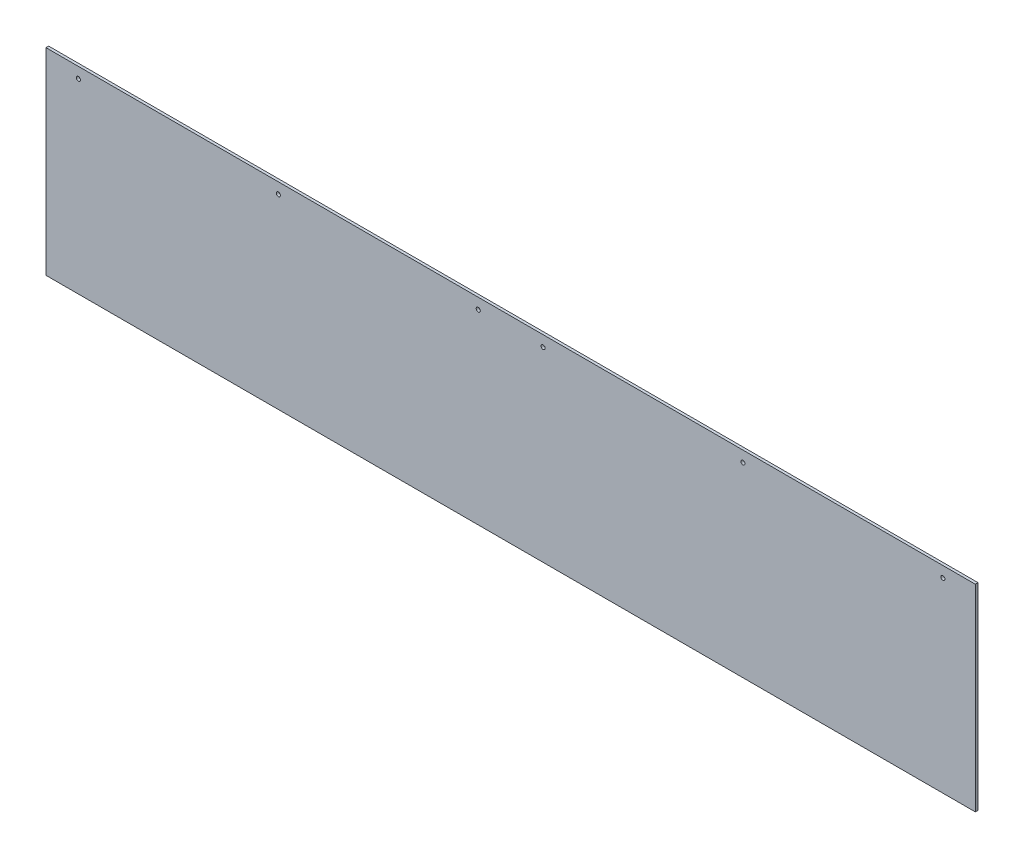
ISO-10303-21;
HEADER;
FILE_DESCRIPTION(('STEP AP214'),'2;1');
FILE_NAME('part.step','',(''),(''),'','','');
FILE_SCHEMA(('AUTOMOTIVE_DESIGN { 1 0 10303 214 1 1 1 1 }'));
ENDSEC;
DATA;
#1=APPLICATION_CONTEXT('core data for automotive mechanical design processes');
#2=APPLICATION_PROTOCOL_DEFINITION('international standard','automotive_design',2000,#1);
#3=PRODUCT_CONTEXT('',#1,'mechanical');
#4=PRODUCT('Part','Part','',(#3));
#5=PRODUCT_RELATED_PRODUCT_CATEGORY('part','',(#4));
#6=PRODUCT_DEFINITION_FORMATION('','',#4);
#7=PRODUCT_DEFINITION_CONTEXT('part definition',#1,'design');
#8=PRODUCT_DEFINITION('design','',#6,#7);
#9=PRODUCT_DEFINITION_SHAPE('','',#8);
#10=(LENGTH_UNIT() NAMED_UNIT(*) SI_UNIT(.MILLI.,.METRE.));
#11=(NAMED_UNIT(*) PLANE_ANGLE_UNIT() SI_UNIT($,.RADIAN.));
#12=(NAMED_UNIT(*) SI_UNIT($,.STERADIAN.) SOLID_ANGLE_UNIT());
#13=UNCERTAINTY_MEASURE_WITH_UNIT(LENGTH_MEASURE(1.E-05),#10,'distance_accuracy_value','');
#14=(GEOMETRIC_REPRESENTATION_CONTEXT(3) GLOBAL_UNCERTAINTY_ASSIGNED_CONTEXT((#13)) GLOBAL_UNIT_ASSIGNED_CONTEXT((#10,
#11,#12)) REPRESENTATION_CONTEXT('',''));
#15=CARTESIAN_POINT('',(0.,0.,0.));
#16=DIRECTION('',(0.,0.,1.));
#17=DIRECTION('',(1.,0.,0.));
#18=AXIS2_PLACEMENT_3D('',#15,#16,#17);
#19=CARTESIAN_POINT('',(1638.3,438.15,-2233.05223517051));
#20=DIRECTION('',(0.,0.,1.));
#21=DIRECTION('',(1.,0.,0.));
#22=AXIS2_PLACEMENT_3D('',#19,#20,#21);
#23=CYLINDRICAL_SURFACE('',#22,4.826);
#24=CARTESIAN_POINT('',(1638.3,438.15,-6.3499999999999));
#25=DIRECTION('',(0.,0.,1.));
#26=DIRECTION('',(1.,0.,0.));
#27=AXIS2_PLACEMENT_3D('',#24,#25,#26);
#28=CIRCLE('',#27,4.826);
#29=CARTESIAN_POINT('',(1643.126,438.15,-6.3499999999999));
#30=VERTEX_POINT('',#29);
#31=EDGE_CURVE('E81',#30,#30,#28,.T.);
#32=ORIENTED_EDGE('',*,*,#31,.F.);
#33=EDGE_LOOP('',(#32));
#34=FACE_BOUND('',#33,.T.);
#35=CARTESIAN_POINT('',(1638.3,438.15,0.));
#36=DIRECTION('',(0.,0.,-1.));
#37=DIRECTION('',(0.,-1.,0.));
#38=AXIS2_PLACEMENT_3D('',#35,#36,#37);
#39=CIRCLE('',#38,4.826);
#40=CARTESIAN_POINT('',(1638.3,433.324,0.));
#41=VERTEX_POINT('',#40);
#42=EDGE_CURVE('E94',#41,#41,#39,.T.);
#43=ORIENTED_EDGE('',*,*,#42,.F.);
#44=EDGE_LOOP('',(#43));
#45=FACE_BOUND('',#44,.T.);
#46=ADVANCED_FACE('F16',(#34,#45),#23,.F.);
#47=CARTESIAN_POINT('',(1016.,438.15,-2233.05223517051));
#48=DIRECTION('',(0.,0.,1.));
#49=DIRECTION('',(1.,0.,0.));
#50=AXIS2_PLACEMENT_3D('',#47,#48,#49);
#51=CYLINDRICAL_SURFACE('',#50,4.826);
#52=CARTESIAN_POINT('',(1016.,438.15,-6.3499999999999));
#53=DIRECTION('',(0.,0.,1.));
#54=DIRECTION('',(1.,0.,0.));
#55=AXIS2_PLACEMENT_3D('',#52,#53,#54);
#56=CIRCLE('',#55,4.826);
#57=CARTESIAN_POINT('',(1020.826,438.15,-6.3499999999999));
#58=VERTEX_POINT('',#57);
#59=EDGE_CURVE('E120',#58,#58,#56,.T.);
#60=ORIENTED_EDGE('',*,*,#59,.F.);
#61=EDGE_LOOP('',(#60));
#62=FACE_BOUND('',#61,.T.);
#63=CARTESIAN_POINT('',(1016.,438.15,0.));
#64=DIRECTION('',(0.,0.,-1.));
#65=DIRECTION('',(0.,-1.,0.));
#66=AXIS2_PLACEMENT_3D('',#63,#64,#65);
#67=CIRCLE('',#66,4.826);
#68=CARTESIAN_POINT('',(1016.,433.324,0.));
#69=VERTEX_POINT('',#68);
#70=EDGE_CURVE('E117',#69,#69,#67,.T.);
#71=ORIENTED_EDGE('',*,*,#70,.F.);
#72=EDGE_LOOP('',(#71));
#73=FACE_BOUND('',#72,.T.);
#74=ADVANCED_FACE('F133',(#62,#73),#51,.F.);
#75=CARTESIAN_POINT('',(76.2,438.15,-2233.05223517051));
#76=DIRECTION('',(0.,0.,1.));
#77=DIRECTION('',(1.,0.,0.));
#78=AXIS2_PLACEMENT_3D('',#75,#76,#77);
#79=CYLINDRICAL_SURFACE('',#78,4.826);
#80=CARTESIAN_POINT('',(76.2,438.15,-6.3499999999999));
#81=DIRECTION('',(0.,0.,1.));
#82=DIRECTION('',(1.,0.,0.));
#83=AXIS2_PLACEMENT_3D('',#80,#81,#82);
#84=CIRCLE('',#83,4.826);
#85=CARTESIAN_POINT('',(81.026,438.15,-6.3499999999999));
#86=VERTEX_POINT('',#85);
#87=EDGE_CURVE('E114',#86,#86,#84,.T.);
#88=ORIENTED_EDGE('',*,*,#87,.F.);
#89=EDGE_LOOP('',(#88));
#90=FACE_BOUND('',#89,.T.);
#91=CARTESIAN_POINT('',(76.2,438.15,0.));
#92=DIRECTION('',(0.,0.,-1.));
#93=DIRECTION('',(0.,-1.,0.));
#94=AXIS2_PLACEMENT_3D('',#91,#92,#93);
#95=CIRCLE('',#94,4.826);
#96=CARTESIAN_POINT('',(76.2,433.324,0.));
#97=VERTEX_POINT('',#96);
#98=EDGE_CURVE('E111',#97,#97,#95,.T.);
#99=ORIENTED_EDGE('',*,*,#98,.F.);
#100=EDGE_LOOP('',(#99));
#101=FACE_BOUND('',#100,.T.);
#102=ADVANCED_FACE('F173',(#90,#101),#79,.F.);
#103=CARTESIAN_POINT('',(546.1,438.15,-2233.05223517051));
#104=DIRECTION('',(0.,0.,1.));
#105=DIRECTION('',(1.,0.,0.));
#106=AXIS2_PLACEMENT_3D('',#103,#104,#105);
#107=CYLINDRICAL_SURFACE('',#106,4.826);
#108=CARTESIAN_POINT('',(546.1,438.15,-6.3499999999999));
#109=DIRECTION('',(0.,0.,1.));
#110=DIRECTION('',(1.,0.,0.));
#111=AXIS2_PLACEMENT_3D('',#108,#109,#110);
#112=CIRCLE('',#111,4.826);
#113=CARTESIAN_POINT('',(550.926,438.15,-6.3499999999999));
#114=VERTEX_POINT('',#113);
#115=EDGE_CURVE('E108',#114,#114,#112,.T.);
#116=ORIENTED_EDGE('',*,*,#115,.F.);
#117=EDGE_LOOP('',(#116));
#118=FACE_BOUND('',#117,.T.);
#119=CARTESIAN_POINT('',(546.1,438.15,0.));
#120=DIRECTION('',(0.,0.,-1.));
#121=DIRECTION('',(0.,-1.,0.));
#122=AXIS2_PLACEMENT_3D('',#119,#120,#121);
#123=CIRCLE('',#122,4.826);
#124=CARTESIAN_POINT('',(546.1,433.324,0.));
#125=VERTEX_POINT('',#124);
#126=EDGE_CURVE('E105',#125,#125,#123,.T.);
#127=ORIENTED_EDGE('',*,*,#126,.F.);
#128=EDGE_LOOP('',(#127));
#129=FACE_BOUND('',#128,.T.);
#130=ADVANCED_FACE('F159',(#118,#129),#107,.F.);
#131=CARTESIAN_POINT('',(1168.4,438.15,-2233.05223517051));
#132=DIRECTION('',(0.,0.,1.));
#133=DIRECTION('',(1.,0.,0.));
#134=AXIS2_PLACEMENT_3D('',#131,#132,#133);
#135=CYLINDRICAL_SURFACE('',#134,4.826);
#136=CARTESIAN_POINT('',(1168.4,438.15,-6.3499999999999));
#137=DIRECTION('',(0.,0.,1.));
#138=DIRECTION('',(1.,0.,0.));
#139=AXIS2_PLACEMENT_3D('',#136,#137,#138);
#140=CIRCLE('',#139,4.826);
#141=CARTESIAN_POINT('',(1173.226,438.15,-6.3499999999999));
#142=VERTEX_POINT('',#141);
#143=EDGE_CURVE('E88',#142,#142,#140,.T.);
#144=ORIENTED_EDGE('',*,*,#143,.F.);
#145=EDGE_LOOP('',(#144));
#146=FACE_BOUND('',#145,.T.);
#147=CARTESIAN_POINT('',(1168.4,438.15,0.));
#148=DIRECTION('',(0.,0.,-1.));
#149=DIRECTION('',(0.,-1.,0.));
#150=AXIS2_PLACEMENT_3D('',#147,#148,#149);
#151=CIRCLE('',#150,4.826);
#152=CARTESIAN_POINT('',(1168.4,433.324,0.));
#153=VERTEX_POINT('',#152);
#154=EDGE_CURVE('E101',#153,#153,#151,.T.);
#155=ORIENTED_EDGE('',*,*,#154,.F.);
#156=EDGE_LOOP('',(#155));
#157=FACE_BOUND('',#156,.T.);
#158=ADVANCED_FACE('F150',(#146,#157),#135,.F.);
#159=CARTESIAN_POINT('',(2108.2,438.15,-2233.05223517051));
#160=DIRECTION('',(0.,0.,1.));
#161=DIRECTION('',(1.,0.,0.));
#162=AXIS2_PLACEMENT_3D('',#159,#160,#161);
#163=CYLINDRICAL_SURFACE('',#162,4.826);
#164=CARTESIAN_POINT('',(2108.2,438.15,-6.3499999999999));
#165=DIRECTION('',(0.,0.,1.));
#166=DIRECTION('',(1.,0.,0.));
#167=AXIS2_PLACEMENT_3D('',#164,#165,#166);
#168=CIRCLE('',#167,4.826);
#169=CARTESIAN_POINT('',(2113.026,438.15,-6.3499999999999));
#170=VERTEX_POINT('',#169);
#171=EDGE_CURVE('E86',#170,#170,#168,.T.);
#172=ORIENTED_EDGE('',*,*,#171,.F.);
#173=EDGE_LOOP('',(#172));
#174=FACE_BOUND('',#173,.T.);
#175=CARTESIAN_POINT('',(2108.2,438.15,0.));
#176=DIRECTION('',(0.,0.,-1.));
#177=DIRECTION('',(0.,-1.,0.));
#178=AXIS2_PLACEMENT_3D('',#175,#176,#177);
#179=CIRCLE('',#178,4.826);
#180=CARTESIAN_POINT('',(2108.2,433.324,0.));
#181=VERTEX_POINT('',#180);
#182=EDGE_CURVE('E99',#181,#181,#179,.T.);
#183=ORIENTED_EDGE('',*,*,#182,.F.);
#184=EDGE_LOOP('',(#183));
#185=FACE_BOUND('',#184,.T.);
#186=ADVANCED_FACE('F18',(#174,#185),#163,.F.);
#187=CARTESIAN_POINT('',(2184.4,463.55,0.));
#188=DIRECTION('',(1.,0.,0.));
#189=DIRECTION('',(0.,0.,-1.));
#190=AXIS2_PLACEMENT_3D('',#187,#188,#189);
#191=PLANE('',#190);
#192=DIRECTION('',(0.,1.,0.));
#193=VECTOR('',#192,1.);
#194=CARTESIAN_POINT('',(2184.4,0.,0.));
#195=LINE('',#194,#193);
#196=CARTESIAN_POINT('',(2184.4,0.,0.));
#197=VERTEX_POINT('',#196);
#198=CARTESIAN_POINT('',(2184.4,463.55,0.));
#199=VERTEX_POINT('',#198);
#200=EDGE_CURVE('E34',#197,#199,#195,.T.);
#201=ORIENTED_EDGE('',*,*,#200,.F.);
#202=DIRECTION('',(0.,0.,-1.));
#203=VECTOR('',#202,1.);
#204=CARTESIAN_POINT('',(2184.4,0.,0.));
#205=LINE('',#204,#203);
#206=CARTESIAN_POINT('',(2184.4,0.,-6.35));
#207=VERTEX_POINT('',#206);
#208=EDGE_CURVE('E10',#197,#207,#205,.T.);
#209=ORIENTED_EDGE('',*,*,#208,.T.);
#210=DIRECTION('',(0.,-1.,0.));
#211=VECTOR('',#210,1.);
#212=CARTESIAN_POINT('',(2184.4,463.55,-6.35));
#213=LINE('',#212,#211);
#214=CARTESIAN_POINT('',(2184.4,463.55,-6.35));
#215=VERTEX_POINT('',#214);
#216=EDGE_CURVE('E79',#215,#207,#213,.T.);
#217=ORIENTED_EDGE('',*,*,#216,.F.);
#218=DIRECTION('',(0.,0.,-1.));
#219=VECTOR('',#218,1.);
#220=CARTESIAN_POINT('',(2184.4,463.55,0.));
#221=LINE('',#220,#219);
#222=EDGE_CURVE('E26',#199,#215,#221,.T.);
#223=ORIENTED_EDGE('',*,*,#222,.F.);
#224=EDGE_LOOP('',(#201,#209,#217,#223));
#225=FACE_BOUND('',#224,.T.);
#226=ADVANCED_FACE('F83',(#225),#191,.T.);
#227=CARTESIAN_POINT('',(0.,463.55,0.));
#228=DIRECTION('',(0.,1.,0.));
#229=DIRECTION('',(0.,0.,1.));
#230=AXIS2_PLACEMENT_3D('',#227,#228,#229);
#231=PLANE('',#230);
#232=DIRECTION('',(-1.,0.,0.));
#233=VECTOR('',#232,1.);
#234=CARTESIAN_POINT('',(2184.4,463.55,0.));
#235=LINE('',#234,#233);
#236=CARTESIAN_POINT('',(0.,463.55,0.));
#237=VERTEX_POINT('',#236);
#238=EDGE_CURVE('E90',#199,#237,#235,.T.);
#239=ORIENTED_EDGE('',*,*,#238,.F.);
#240=ORIENTED_EDGE('',*,*,#222,.T.);
#241=DIRECTION('',(1.,0.,0.));
#242=VECTOR('',#241,1.);
#243=CARTESIAN_POINT('',(0.,463.55,-6.35));
#244=LINE('',#243,#242);
#245=CARTESIAN_POINT('',(0.,463.55,-6.35));
#246=VERTEX_POINT('',#245);
#247=EDGE_CURVE('E70',#246,#215,#244,.T.);
#248=ORIENTED_EDGE('',*,*,#247,.F.);
#249=DIRECTION('',(0.,0.,-1.));
#250=VECTOR('',#249,1.);
#251=CARTESIAN_POINT('',(0.,463.55,0.));
#252=LINE('',#251,#250);
#253=EDGE_CURVE('E66',#237,#246,#252,.T.);
#254=ORIENTED_EDGE('',*,*,#253,.F.);
#255=EDGE_LOOP('',(#239,#240,#248,#254));
#256=FACE_BOUND('',#255,.T.);
#257=ADVANCED_FACE('F157',(#256),#231,.T.);
#258=CARTESIAN_POINT('',(0.,0.,0.));
#259=DIRECTION('',(-1.,0.,0.));
#260=DIRECTION('',(0.,0.,1.));
#261=AXIS2_PLACEMENT_3D('',#258,#259,#260);
#262=PLANE('',#261);
#263=DIRECTION('',(0.,-1.,0.));
#264=VECTOR('',#263,1.);
#265=CARTESIAN_POINT('',(0.,463.55,0.));
#266=LINE('',#265,#264);
#267=CARTESIAN_POINT('',(0.,0.,0.));
#268=VERTEX_POINT('',#267);
#269=EDGE_CURVE('E54',#237,#268,#266,.T.);
#270=ORIENTED_EDGE('',*,*,#269,.F.);
#271=ORIENTED_EDGE('',*,*,#253,.T.);
#272=DIRECTION('',(0.,1.,0.));
#273=VECTOR('',#272,1.);
#274=CARTESIAN_POINT('',(0.,0.,-6.35));
#275=LINE('',#274,#273);
#276=CARTESIAN_POINT('',(0.,0.,-6.35));
#277=VERTEX_POINT('',#276);
#278=EDGE_CURVE('E60',#277,#246,#275,.T.);
#279=ORIENTED_EDGE('',*,*,#278,.F.);
#280=DIRECTION('',(0.,0.,-1.));
#281=VECTOR('',#280,1.);
#282=CARTESIAN_POINT('',(0.,0.,0.));
#283=LINE('',#282,#281);
#284=EDGE_CURVE('E63',#268,#277,#283,.T.);
#285=ORIENTED_EDGE('',*,*,#284,.F.);
#286=EDGE_LOOP('',(#270,#271,#279,#285));
#287=FACE_BOUND('',#286,.T.);
#288=ADVANCED_FACE('F62',(#287),#262,.T.);
#289=CARTESIAN_POINT('',(2184.4,0.,0.));
#290=DIRECTION('',(0.,-1.,0.));
#291=DIRECTION('',(0.,0.,-1.));
#292=AXIS2_PLACEMENT_3D('',#289,#290,#291);
#293=PLANE('',#292);
#294=DIRECTION('',(1.,0.,0.));
#295=VECTOR('',#294,1.);
#296=CARTESIAN_POINT('',(0.,0.,0.));
#297=LINE('',#296,#295);
#298=EDGE_CURVE('E75',#268,#197,#297,.T.);
#299=ORIENTED_EDGE('',*,*,#298,.F.);
#300=ORIENTED_EDGE('',*,*,#284,.T.);
#301=DIRECTION('',(-1.,0.,0.));
#302=VECTOR('',#301,1.);
#303=CARTESIAN_POINT('',(2184.4,0.,-6.35));
#304=LINE('',#303,#302);
#305=EDGE_CURVE('E20',#207,#277,#304,.T.);
#306=ORIENTED_EDGE('',*,*,#305,.F.);
#307=ORIENTED_EDGE('',*,*,#208,.F.);
#308=EDGE_LOOP('',(#299,#300,#306,#307));
#309=FACE_BOUND('',#308,.T.);
#310=ADVANCED_FACE('F74',(#309),#293,.T.);
#311=CARTESIAN_POINT('',(1092.2,231.775,-6.35));
#312=DIRECTION('',(0.,0.,1.));
#313=DIRECTION('',(1.,0.,0.));
#314=AXIS2_PLACEMENT_3D('',#311,#312,#313);
#315=PLANE('',#314);
#316=ORIENTED_EDGE('',*,*,#305,.T.);
#317=ORIENTED_EDGE('',*,*,#278,.T.);
#318=ORIENTED_EDGE('',*,*,#247,.T.);
#319=ORIENTED_EDGE('',*,*,#216,.T.);
#320=EDGE_LOOP('',(#316,#317,#318,#319));
#321=FACE_BOUND('',#320,.T.);
#322=ORIENTED_EDGE('',*,*,#31,.T.);
#323=EDGE_LOOP('',(#322));
#324=FACE_BOUND('',#323,.T.);
#325=ORIENTED_EDGE('',*,*,#59,.T.);
#326=EDGE_LOOP('',(#325));
#327=FACE_BOUND('',#326,.T.);
#328=ORIENTED_EDGE('',*,*,#87,.T.);
#329=EDGE_LOOP('',(#328));
#330=FACE_BOUND('',#329,.T.);
#331=ORIENTED_EDGE('',*,*,#115,.T.);
#332=EDGE_LOOP('',(#331));
#333=FACE_BOUND('',#332,.T.);
#334=ORIENTED_EDGE('',*,*,#143,.T.);
#335=EDGE_LOOP('',(#334));
#336=FACE_BOUND('',#335,.T.);
#337=ORIENTED_EDGE('',*,*,#171,.T.);
#338=EDGE_LOOP('',(#337));
#339=FACE_BOUND('',#338,.T.);
#340=ADVANCED_FACE('F77',(#321,#324,#327,#330,#333,#336,#339),#315,.F.);
#341=CARTESIAN_POINT('',(1092.2,231.775,0.));
#342=DIRECTION('',(0.,0.,1.));
#343=DIRECTION('',(1.,0.,0.));
#344=AXIS2_PLACEMENT_3D('',#341,#342,#343);
#345=PLANE('',#344);
#346=ORIENTED_EDGE('',*,*,#298,.T.);
#347=ORIENTED_EDGE('',*,*,#200,.T.);
#348=ORIENTED_EDGE('',*,*,#238,.T.);
#349=ORIENTED_EDGE('',*,*,#269,.T.);
#350=EDGE_LOOP('',(#346,#347,#348,#349));
#351=FACE_BOUND('',#350,.T.);
#352=ORIENTED_EDGE('',*,*,#42,.T.);
#353=EDGE_LOOP('',(#352));
#354=FACE_BOUND('',#353,.T.);
#355=ORIENTED_EDGE('',*,*,#70,.T.);
#356=EDGE_LOOP('',(#355));
#357=FACE_BOUND('',#356,.T.);
#358=ORIENTED_EDGE('',*,*,#98,.T.);
#359=EDGE_LOOP('',(#358));
#360=FACE_BOUND('',#359,.T.);
#361=ORIENTED_EDGE('',*,*,#126,.T.);
#362=EDGE_LOOP('',(#361));
#363=FACE_BOUND('',#362,.T.);
#364=ORIENTED_EDGE('',*,*,#154,.T.);
#365=EDGE_LOOP('',(#364));
#366=FACE_BOUND('',#365,.T.);
#367=ORIENTED_EDGE('',*,*,#182,.T.);
#368=EDGE_LOOP('',(#367));
#369=FACE_BOUND('',#368,.T.);
#370=ADVANCED_FACE('F84',(#351,#354,#357,#360,#363,#366,#369),#345,.T.);
#371=CLOSED_SHELL('',(#46,#74,#102,#130,#158,#186,#226,#257,#288,#310,#340,#370));
#372=MANIFOLD_SOLID_BREP('B1',#371);
#373=ADVANCED_BREP_SHAPE_REPRESENTATION('',(#18,#372),#14);
#374=SHAPE_DEFINITION_REPRESENTATION(#9,#373);
ENDSEC;
END-ISO-10303-21;
